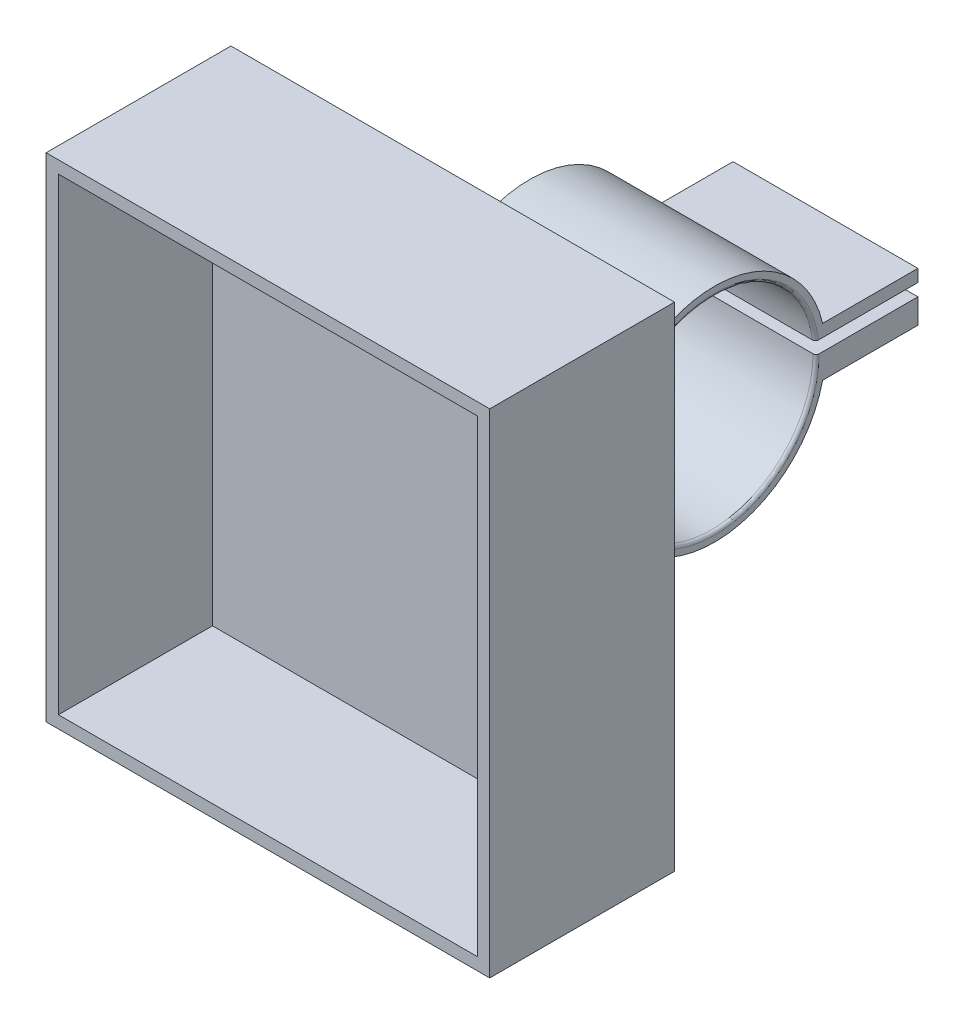
ISO-10303-21;
HEADER;
FILE_DESCRIPTION(('STEP AP214'),'2;1');
FILE_NAME('part.step','',(''),(''),'','','');
FILE_SCHEMA(('AUTOMOTIVE_DESIGN { 1 0 10303 214 1 1 1 1 }'));
ENDSEC;
DATA;
#1=APPLICATION_CONTEXT('core data for automotive mechanical design processes');
#2=APPLICATION_PROTOCOL_DEFINITION('international standard','automotive_design',2000,#1);
#3=PRODUCT_CONTEXT('',#1,'mechanical');
#4=PRODUCT('Part','Part','',(#3));
#5=PRODUCT_RELATED_PRODUCT_CATEGORY('part','',(#4));
#6=PRODUCT_DEFINITION_FORMATION('','',#4);
#7=PRODUCT_DEFINITION_CONTEXT('part definition',#1,'design');
#8=PRODUCT_DEFINITION('design','',#6,#7);
#9=PRODUCT_DEFINITION_SHAPE('','',#8);
#10=(LENGTH_UNIT() NAMED_UNIT(*) SI_UNIT(.MILLI.,.METRE.));
#11=(NAMED_UNIT(*) PLANE_ANGLE_UNIT() SI_UNIT($,.RADIAN.));
#12=(NAMED_UNIT(*) SI_UNIT($,.STERADIAN.) SOLID_ANGLE_UNIT());
#13=UNCERTAINTY_MEASURE_WITH_UNIT(LENGTH_MEASURE(1.E-05),#10,'distance_accuracy_value','');
#14=(GEOMETRIC_REPRESENTATION_CONTEXT(3) GLOBAL_UNCERTAINTY_ASSIGNED_CONTEXT((#13)) GLOBAL_UNIT_ASSIGNED_CONTEXT((#10,
#11,#12)) REPRESENTATION_CONTEXT('',''));
#15=CARTESIAN_POINT('',(0.,0.,0.));
#16=DIRECTION('',(0.,0.,1.));
#17=DIRECTION('',(1.,0.,0.));
#18=AXIS2_PLACEMENT_3D('',#15,#16,#17);
#19=CARTESIAN_POINT('',(-15.,0.,-60.4925687367722));
#20=DIRECTION('',(0.,0.,-1.));
#21=DIRECTION('',(-1.,0.,0.));
#22=AXIS2_PLACEMENT_3D('',#19,#20,#21);
#23=PLANE('',#22);
#24=DIRECTION('',(0.,1.,0.));
#25=VECTOR('',#24,1.);
#26=CARTESIAN_POINT('',(-15.,0.,-60.4925687367722));
#27=LINE('',#26,#25);
#28=CARTESIAN_POINT('',(-15.,-4.,-60.4925687367722));
#29=VERTEX_POINT('',#28);
#30=CARTESIAN_POINT('',(-15.,0.,-60.4925687367722));
#31=VERTEX_POINT('',#30);
#32=EDGE_CURVE('E191',#29,#31,#27,.T.);
#33=ORIENTED_EDGE('',*,*,#32,.T.);
#34=DIRECTION('',(1.,0.,0.));
#35=VECTOR('',#34,1.);
#36=CARTESIAN_POINT('',(-25.,0.,-60.4925687367722));
#37=LINE('',#36,#35);
#38=CARTESIAN_POINT('',(15.,0.,-60.4925687367722));
#39=VERTEX_POINT('',#38);
#40=EDGE_CURVE('E179',#31,#39,#37,.T.);
#41=ORIENTED_EDGE('',*,*,#40,.T.);
#42=DIRECTION('',(0.,1.,0.));
#43=VECTOR('',#42,1.);
#44=CARTESIAN_POINT('',(15.,0.,-60.4925687367722));
#45=LINE('',#44,#43);
#46=CARTESIAN_POINT('',(15.,-4.,-60.4925687367722));
#47=VERTEX_POINT('',#46);
#48=EDGE_CURVE('E193',#47,#39,#45,.T.);
#49=ORIENTED_EDGE('',*,*,#48,.F.);
#50=DIRECTION('',(1.,0.,0.));
#51=VECTOR('',#50,1.);
#52=CARTESIAN_POINT('',(-15.,-4.,-60.4925687367722));
#53=LINE('',#52,#51);
#54=EDGE_CURVE('E226',#29,#47,#53,.T.);
#55=ORIENTED_EDGE('',*,*,#54,.F.);
#56=EDGE_LOOP('',(#33,#41,#49,#55));
#57=FACE_BOUND('',#56,.T.);
#58=ADVANCED_FACE('F50',(#57),#23,.T.);
#59=CARTESIAN_POINT('',(-36.,-40.,30.));
#60=DIRECTION('',(1.,0.,0.));
#61=DIRECTION('',(0.,0.,-1.));
#62=AXIS2_PLACEMENT_3D('',#59,#60,#61);
#63=PLANE('',#62);
#64=DIRECTION('',(0.,-1.,0.));
#65=VECTOR('',#64,1.);
#66=CARTESIAN_POINT('',(-36.,-40.,0.));
#67=LINE('',#66,#65);
#68=CARTESIAN_POINT('',(-36.,40.,0.));
#69=VERTEX_POINT('',#68);
#70=CARTESIAN_POINT('',(-36.,-40.,0.));
#71=VERTEX_POINT('',#70);
#72=EDGE_CURVE('E284',#69,#71,#67,.T.);
#73=ORIENTED_EDGE('',*,*,#72,.T.);
#74=DIRECTION('',(0.,0.,-1.));
#75=VECTOR('',#74,1.);
#76=CARTESIAN_POINT('',(-36.,-40.,30.));
#77=LINE('',#76,#75);
#78=CARTESIAN_POINT('',(-36.,-40.,30.));
#79=VERTEX_POINT('',#78);
#80=EDGE_CURVE('E328',#79,#71,#77,.T.);
#81=ORIENTED_EDGE('',*,*,#80,.F.);
#82=DIRECTION('',(0.,-1.,0.));
#83=VECTOR('',#82,1.);
#84=CARTESIAN_POINT('',(-36.,-40.,30.));
#85=LINE('',#84,#83);
#86=CARTESIAN_POINT('',(-36.,40.,30.));
#87=VERTEX_POINT('',#86);
#88=EDGE_CURVE('E291',#87,#79,#85,.T.);
#89=ORIENTED_EDGE('',*,*,#88,.F.);
#90=DIRECTION('',(0.,0.,-1.));
#91=VECTOR('',#90,1.);
#92=CARTESIAN_POINT('',(-36.,40.,30.));
#93=LINE('',#92,#91);
#94=EDGE_CURVE('E310',#87,#69,#93,.T.);
#95=ORIENTED_EDGE('',*,*,#94,.T.);
#96=EDGE_LOOP('',(#73,#81,#89,#95));
#97=FACE_BOUND('',#96,.T.);
#98=ADVANCED_FACE('F407',(#97),#63,.F.);
#99=CARTESIAN_POINT('',(36.,-40.,30.));
#100=DIRECTION('',(0.,1.,0.));
#101=DIRECTION('',(-1.,0.,0.));
#102=AXIS2_PLACEMENT_3D('',#99,#100,#101);
#103=PLANE('',#102);
#104=DIRECTION('',(1.,0.,0.));
#105=VECTOR('',#104,1.);
#106=CARTESIAN_POINT('',(36.,-40.,0.));
#107=LINE('',#106,#105);
#108=CARTESIAN_POINT('',(36.,-40.,0.));
#109=VERTEX_POINT('',#108);
#110=EDGE_CURVE('E311',#71,#109,#107,.T.);
#111=ORIENTED_EDGE('',*,*,#110,.T.);
#112=DIRECTION('',(0.,0.,-1.));
#113=VECTOR('',#112,1.);
#114=CARTESIAN_POINT('',(36.,-40.,30.));
#115=LINE('',#114,#113);
#116=CARTESIAN_POINT('',(36.,-40.,30.));
#117=VERTEX_POINT('',#116);
#118=EDGE_CURVE('E327',#117,#109,#115,.T.);
#119=ORIENTED_EDGE('',*,*,#118,.F.);
#120=DIRECTION('',(1.,0.,0.));
#121=VECTOR('',#120,1.);
#122=CARTESIAN_POINT('',(36.,-40.,30.));
#123=LINE('',#122,#121);
#124=EDGE_CURVE('E300',#79,#117,#123,.T.);
#125=ORIENTED_EDGE('',*,*,#124,.F.);
#126=ORIENTED_EDGE('',*,*,#80,.T.);
#127=EDGE_LOOP('',(#111,#119,#125,#126));
#128=FACE_BOUND('',#127,.T.);
#129=ADVANCED_FACE('F414',(#128),#103,.F.);
#130=CARTESIAN_POINT('',(36.,-40.,30.));
#131=DIRECTION('',(-1.,0.,0.));
#132=DIRECTION('',(0.,0.,1.));
#133=AXIS2_PLACEMENT_3D('',#130,#131,#132);
#134=PLANE('',#133);
#135=DIRECTION('',(0.,1.,0.));
#136=VECTOR('',#135,1.);
#137=CARTESIAN_POINT('',(36.,-40.,0.));
#138=LINE('',#137,#136);
#139=CARTESIAN_POINT('',(36.,40.,0.));
#140=VERTEX_POINT('',#139);
#141=EDGE_CURVE('E313',#109,#140,#138,.T.);
#142=ORIENTED_EDGE('',*,*,#141,.T.);
#143=DIRECTION('',(0.,0.,-1.));
#144=VECTOR('',#143,1.);
#145=CARTESIAN_POINT('',(36.,40.,30.));
#146=LINE('',#145,#144);
#147=CARTESIAN_POINT('',(36.,40.,30.));
#148=VERTEX_POINT('',#147);
#149=EDGE_CURVE('E325',#148,#140,#146,.T.);
#150=ORIENTED_EDGE('',*,*,#149,.F.);
#151=DIRECTION('',(0.,1.,0.));
#152=VECTOR('',#151,1.);
#153=CARTESIAN_POINT('',(36.,-40.,30.));
#154=LINE('',#153,#152);
#155=EDGE_CURVE('E301',#117,#148,#154,.T.);
#156=ORIENTED_EDGE('',*,*,#155,.F.);
#157=ORIENTED_EDGE('',*,*,#118,.T.);
#158=EDGE_LOOP('',(#142,#150,#156,#157));
#159=FACE_BOUND('',#158,.T.);
#160=ADVANCED_FACE('F420',(#159),#134,.F.);
#161=CARTESIAN_POINT('',(36.,40.,30.));
#162=DIRECTION('',(0.,-1.,0.));
#163=DIRECTION('',(1.,0.,0.));
#164=AXIS2_PLACEMENT_3D('',#161,#162,#163);
#165=PLANE('',#164);
#166=DIRECTION('',(-1.,0.,0.));
#167=VECTOR('',#166,1.);
#168=CARTESIAN_POINT('',(36.,40.,0.));
#169=LINE('',#168,#167);
#170=EDGE_CURVE('E296',#140,#69,#169,.T.);
#171=ORIENTED_EDGE('',*,*,#170,.T.);
#172=ORIENTED_EDGE('',*,*,#94,.F.);
#173=DIRECTION('',(-1.,0.,0.));
#174=VECTOR('',#173,1.);
#175=CARTESIAN_POINT('',(36.,40.,30.));
#176=LINE('',#175,#174);
#177=EDGE_CURVE('E302',#148,#87,#176,.T.);
#178=ORIENTED_EDGE('',*,*,#177,.F.);
#179=ORIENTED_EDGE('',*,*,#149,.T.);
#180=EDGE_LOOP('',(#171,#172,#178,#179));
#181=FACE_BOUND('',#180,.T.);
#182=ADVANCED_FACE('F423',(#181),#165,.F.);
#183=CARTESIAN_POINT('',(0.,0.,30.));
#184=DIRECTION('',(0.,0.,1.));
#185=DIRECTION('',(1.,0.,0.));
#186=AXIS2_PLACEMENT_3D('',#183,#184,#185);
#187=PLANE('',#186);
#188=DIRECTION('',(0.,-1.,0.));
#189=VECTOR('',#188,1.);
#190=CARTESIAN_POINT('',(-34.,-38.,30.));
#191=LINE('',#190,#189);
#192=CARTESIAN_POINT('',(-34.,38.,30.));
#193=VERTEX_POINT('',#192);
#194=CARTESIAN_POINT('',(-34.,-38.,30.));
#195=VERTEX_POINT('',#194);
#196=EDGE_CURVE('E268',#193,#195,#191,.T.);
#197=ORIENTED_EDGE('',*,*,#196,.F.);
#198=DIRECTION('',(-1.,0.,0.));
#199=VECTOR('',#198,1.);
#200=CARTESIAN_POINT('',(34.,38.,30.));
#201=LINE('',#200,#199);
#202=CARTESIAN_POINT('',(34.,38.,30.));
#203=VERTEX_POINT('',#202);
#204=EDGE_CURVE('E254',#203,#193,#201,.T.);
#205=ORIENTED_EDGE('',*,*,#204,.F.);
#206=DIRECTION('',(0.,1.,0.));
#207=VECTOR('',#206,1.);
#208=CARTESIAN_POINT('',(34.,-38.,30.));
#209=LINE('',#208,#207);
#210=CARTESIAN_POINT('',(34.,-38.,30.));
#211=VERTEX_POINT('',#210);
#212=EDGE_CURVE('E271',#211,#203,#209,.T.);
#213=ORIENTED_EDGE('',*,*,#212,.F.);
#214=DIRECTION('',(1.,0.,0.));
#215=VECTOR('',#214,1.);
#216=CARTESIAN_POINT('',(34.,-38.,30.));
#217=LINE('',#216,#215);
#218=EDGE_CURVE('E267',#195,#211,#217,.T.);
#219=ORIENTED_EDGE('',*,*,#218,.F.);
#220=EDGE_LOOP('',(#197,#205,#213,#219));
#221=FACE_BOUND('',#220,.T.);
#222=ORIENTED_EDGE('',*,*,#88,.T.);
#223=ORIENTED_EDGE('',*,*,#124,.T.);
#224=ORIENTED_EDGE('',*,*,#155,.T.);
#225=ORIENTED_EDGE('',*,*,#177,.T.);
#226=EDGE_LOOP('',(#222,#223,#224,#225));
#227=FACE_BOUND('',#226,.T.);
#228=ADVANCED_FACE('F424',(#221,#227),#187,.T.);
#229=CARTESIAN_POINT('',(0.,0.,0.));
#230=DIRECTION('',(0.,0.,1.));
#231=DIRECTION('',(1.,0.,0.));
#232=AXIS2_PLACEMENT_3D('',#229,#230,#231);
#233=PLANE('',#232);
#234=CARTESIAN_POINT('',(0.,0.,0.));
#235=DIRECTION('',(0.,0.,1.));
#236=DIRECTION('',(1.,0.,0.));
#237=AXIS2_PLACEMENT_3D('',#234,#235,#236);
#238=CIRCLE('',#237,14.25);
#239=CARTESIAN_POINT('',(14.25,0.,0.));
#240=VERTEX_POINT('',#239);
#241=EDGE_CURVE('E336',#240,#240,#238,.T.);
#242=ORIENTED_EDGE('',*,*,#241,.T.);
#243=EDGE_LOOP('',(#242));
#244=FACE_BOUND('',#243,.T.);
#245=ORIENTED_EDGE('',*,*,#72,.F.);
#246=ORIENTED_EDGE('',*,*,#170,.F.);
#247=ORIENTED_EDGE('',*,*,#141,.F.);
#248=ORIENTED_EDGE('',*,*,#110,.F.);
#249=EDGE_LOOP('',(#245,#246,#247,#248));
#250=FACE_BOUND('',#249,.T.);
#251=ADVANCED_FACE('F430',(#244,#250),#233,.F.);
#252=CARTESIAN_POINT('',(-34.,-38.,5.));
#253=DIRECTION('',(-1.,0.,0.));
#254=DIRECTION('',(0.,0.,1.));
#255=AXIS2_PLACEMENT_3D('',#252,#253,#254);
#256=PLANE('',#255);
#257=ORIENTED_EDGE('',*,*,#196,.T.);
#258=DIRECTION('',(0.,0.,1.));
#259=VECTOR('',#258,1.);
#260=CARTESIAN_POINT('',(-34.,-38.,5.));
#261=LINE('',#260,#259);
#262=CARTESIAN_POINT('',(-34.,-38.,5.));
#263=VERTEX_POINT('',#262);
#264=EDGE_CURVE('E263',#263,#195,#261,.T.);
#265=ORIENTED_EDGE('',*,*,#264,.F.);
#266=DIRECTION('',(0.,-1.,0.));
#267=VECTOR('',#266,1.);
#268=CARTESIAN_POINT('',(-34.,-38.,5.));
#269=LINE('',#268,#267);
#270=CARTESIAN_POINT('',(-34.,38.,5.));
#271=VERTEX_POINT('',#270);
#272=EDGE_CURVE('E247',#271,#263,#269,.T.);
#273=ORIENTED_EDGE('',*,*,#272,.F.);
#274=DIRECTION('',(0.,0.,1.));
#275=VECTOR('',#274,1.);
#276=CARTESIAN_POINT('',(-34.,38.,5.));
#277=LINE('',#276,#275);
#278=EDGE_CURVE('E277',#271,#193,#277,.T.);
#279=ORIENTED_EDGE('',*,*,#278,.T.);
#280=EDGE_LOOP('',(#257,#265,#273,#279));
#281=FACE_BOUND('',#280,.T.);
#282=ADVANCED_FACE('F427',(#281),#256,.F.);
#283=CARTESIAN_POINT('',(34.,38.,5.));
#284=DIRECTION('',(0.,1.,0.));
#285=DIRECTION('',(-1.,0.,0.));
#286=AXIS2_PLACEMENT_3D('',#283,#284,#285);
#287=PLANE('',#286);
#288=ORIENTED_EDGE('',*,*,#204,.T.);
#289=ORIENTED_EDGE('',*,*,#278,.F.);
#290=DIRECTION('',(-1.,0.,0.));
#291=VECTOR('',#290,1.);
#292=CARTESIAN_POINT('',(34.,38.,5.));
#293=LINE('',#292,#291);
#294=CARTESIAN_POINT('',(34.,38.,5.));
#295=VERTEX_POINT('',#294);
#296=EDGE_CURVE('E262',#295,#271,#293,.T.);
#297=ORIENTED_EDGE('',*,*,#296,.F.);
#298=DIRECTION('',(0.,0.,1.));
#299=VECTOR('',#298,1.);
#300=CARTESIAN_POINT('',(34.,38.,5.));
#301=LINE('',#300,#299);
#302=EDGE_CURVE('E281',#295,#203,#301,.T.);
#303=ORIENTED_EDGE('',*,*,#302,.T.);
#304=EDGE_LOOP('',(#288,#289,#297,#303));
#305=FACE_BOUND('',#304,.T.);
#306=ADVANCED_FACE('F440',(#305),#287,.F.);
#307=CARTESIAN_POINT('',(34.,-38.,5.));
#308=DIRECTION('',(1.,0.,0.));
#309=DIRECTION('',(0.,0.,-1.));
#310=AXIS2_PLACEMENT_3D('',#307,#308,#309);
#311=PLANE('',#310);
#312=ORIENTED_EDGE('',*,*,#212,.T.);
#313=ORIENTED_EDGE('',*,*,#302,.F.);
#314=DIRECTION('',(0.,1.,0.));
#315=VECTOR('',#314,1.);
#316=CARTESIAN_POINT('',(34.,-38.,5.));
#317=LINE('',#316,#315);
#318=CARTESIAN_POINT('',(34.,-38.,5.));
#319=VERTEX_POINT('',#318);
#320=EDGE_CURVE('E260',#319,#295,#317,.T.);
#321=ORIENTED_EDGE('',*,*,#320,.F.);
#322=DIRECTION('',(0.,0.,1.));
#323=VECTOR('',#322,1.);
#324=CARTESIAN_POINT('',(34.,-38.,5.));
#325=LINE('',#324,#323);
#326=EDGE_CURVE('E290',#319,#211,#325,.T.);
#327=ORIENTED_EDGE('',*,*,#326,.T.);
#328=EDGE_LOOP('',(#312,#313,#321,#327));
#329=FACE_BOUND('',#328,.T.);
#330=ADVANCED_FACE('F442',(#329),#311,.F.);
#331=CARTESIAN_POINT('',(34.,-38.,5.));
#332=DIRECTION('',(0.,-1.,0.));
#333=DIRECTION('',(1.,0.,0.));
#334=AXIS2_PLACEMENT_3D('',#331,#332,#333);
#335=PLANE('',#334);
#336=ORIENTED_EDGE('',*,*,#218,.T.);
#337=ORIENTED_EDGE('',*,*,#326,.F.);
#338=DIRECTION('',(1.,0.,0.));
#339=VECTOR('',#338,1.);
#340=CARTESIAN_POINT('',(34.,-38.,5.));
#341=LINE('',#340,#339);
#342=EDGE_CURVE('E255',#263,#319,#341,.T.);
#343=ORIENTED_EDGE('',*,*,#342,.F.);
#344=ORIENTED_EDGE('',*,*,#264,.T.);
#345=EDGE_LOOP('',(#336,#337,#343,#344));
#346=FACE_BOUND('',#345,.T.);
#347=ADVANCED_FACE('F437',(#346),#335,.F.);
#348=CARTESIAN_POINT('',(0.,0.,5.));
#349=DIRECTION('',(0.,0.,1.));
#350=DIRECTION('',(1.,0.,0.));
#351=AXIS2_PLACEMENT_3D('',#348,#349,#350);
#352=PLANE('',#351);
#353=ORIENTED_EDGE('',*,*,#272,.T.);
#354=ORIENTED_EDGE('',*,*,#342,.T.);
#355=ORIENTED_EDGE('',*,*,#320,.T.);
#356=ORIENTED_EDGE('',*,*,#296,.T.);
#357=EDGE_LOOP('',(#353,#354,#355,#356));
#358=FACE_BOUND('',#357,.T.);
#359=ADVANCED_FACE('F445',(#358),#352,.T.);
#360=CARTESIAN_POINT('',(0.,0.,-15.));
#361=DIRECTION('',(0.,0.,1.));
#362=DIRECTION('',(1.,0.,0.));
#363=AXIS2_PLACEMENT_3D('',#360,#361,#362);
#364=CYLINDRICAL_SURFACE('',#363,10.25);
#365=CARTESIAN_POINT('',(10.25,0.,-9.47936499938877));
#366=CARTESIAN_POINT('',(10.249997772282,0.264519076584649,-9.47936701620797));
#367=CARTESIAN_POINT('',(10.2397441218711,0.529124496482216,-9.4852112686551));
#368=CARTESIAN_POINT('',(10.1988524814933,1.0563624821298,-9.5084491330026));
#369=CARTESIAN_POINT('',(10.1682014925191,1.31899368172281,-9.52585010986655));
#370=CARTESIAN_POINT('',(10.0868204809152,1.84076662311007,-9.5718158341821));
#371=CARTESIAN_POINT('',(10.0360439953682,2.09989884525778,-9.60040641267984));
#372=CARTESIAN_POINT('',(9.91506466552643,2.61213502550928,-9.66803447550246));
#373=CARTESIAN_POINT('',(9.84486475035596,2.86523988631563,-9.70707038460409));
#374=CARTESIAN_POINT('',(9.68622852714192,3.36263269484833,-9.79445153895515));
#375=CARTESIAN_POINT('',(9.59788073180206,3.60695691594657,-9.84275152743456));
#376=CARTESIAN_POINT('',(9.40364867835215,4.08666902217371,-9.94769560275203));
#377=CARTESIAN_POINT('',(9.29776382352484,4.32205660288872,-10.0043399735094));
#378=CARTESIAN_POINT('',(9.06947415220393,4.78258886852613,-10.1247269366167));
#379=CARTESIAN_POINT('',(8.94707913500893,5.00773952419547,-10.1884653145558));
#380=CARTESIAN_POINT('',(8.68661251819837,5.44706409397579,-10.321794742583));
#381=CARTESIAN_POINT('',(8.54853514595756,5.66123392370104,-10.3913879453537));
#382=CARTESIAN_POINT('',(8.24718552075165,6.09266328197374,-10.5402036239691));
#383=CARTESIAN_POINT('',(8.08281638148095,6.30904201607955,-10.6197587310245));
#384=CARTESIAN_POINT('',(7.73814156015187,6.72734129410007,-10.7822623976682));
#385=CARTESIAN_POINT('',(7.55783525242426,6.9292612698219,-10.8652110904149));
#386=CARTESIAN_POINT('',(7.18198830136747,7.31811047700305,-11.0327808893572));
#387=CARTESIAN_POINT('',(6.98643093216818,7.50502278048896,-11.1174037535339));
#388=CARTESIAN_POINT('',(6.58108602120329,7.86288155681463,-11.2863340584831));
#389=CARTESIAN_POINT('',(6.37129804311026,8.03382753972565,-11.3706414895003));
#390=CARTESIAN_POINT('',(5.91488391073257,8.37655288293503,-11.5459318841658));
#391=CARTESIAN_POINT('',(5.66672531682515,8.54643210418336,-11.6366536480956));
#392=CARTESIAN_POINT('',(5.1549230262351,8.86453935462094,-11.8124258786654));
#393=CARTESIAN_POINT('',(4.89127716045122,9.01276434079662,-11.8974755473097));
#394=CARTESIAN_POINT('',(4.35008434235251,9.28606725394415,-12.0587906410431));
#395=CARTESIAN_POINT('',(4.07255489521586,9.4111734400318,-12.1350667467784));
#396=CARTESIAN_POINT('',(3.50489612393043,9.63698227375308,-12.2758685051866));
#397=CARTESIAN_POINT('',(3.21477093133944,9.73769285318384,-12.3403979753684));
#398=CARTESIAN_POINT('',(2.68898225772109,9.89392133115211,-12.4421781801048));
#399=CARTESIAN_POINT('',(2.45537095316852,9.95450712622937,-12.4823071358135));
#400=CARTESIAN_POINT('',(1.98300837340899,10.0592578610227,-12.5523654666443));
#401=CARTESIAN_POINT('',(1.74425812652716,10.1034260542443,-12.5822968625368));
#402=CARTESIAN_POINT('',(1.26330476014067,10.1747534875964,-12.6309219714102));
#403=CARTESIAN_POINT('',(1.02110486383679,10.2019276604604,-12.6496255497513));
#404=CARTESIAN_POINT('',(0.534747386523672,10.2389461901088,-12.6751597867866));
#405=CARTESIAN_POINT('',(0.290589766279507,10.2487901987012,-12.6819902069293));
#406=CARTESIAN_POINT('',(-0.198166247123225,10.2510014587125,-12.6835219539042));
#407=CARTESIAN_POINT('',(-0.442764796176201,10.2433455803668,-12.678207228386));
#408=CARTESIAN_POINT('',(-0.93023119910778,10.2106242542887,-12.6556157153616));
#409=CARTESIAN_POINT('',(-1.17309904626852,10.1855587390165,-12.6383388814488));
#410=CARTESIAN_POINT('',(-1.65550574864583,10.1183570148594,-12.5924412208023));
#411=CARTESIAN_POINT('',(-1.89504259388151,10.0762109253703,-12.5638138283159));
#412=CARTESIAN_POINT('',(-2.36910921634494,9.97539772181839,-12.4962039797184));
#413=CARTESIAN_POINT('',(-2.60363887304666,9.91673021055638,-12.4572212746515));
#414=CARTESIAN_POINT('',(-3.06556307278674,9.78378120583667,-12.3702981595879));
#415=CARTESIAN_POINT('',(-3.29298045201288,9.70955724126812,-12.3223908241364));
#416=CARTESIAN_POINT('',(-3.74058008280692,9.54606599529802,-12.2188939536657));
#417=CARTESIAN_POINT('',(-3.96075981439855,9.45679353929937,-12.1633017773125));
#418=CARTESIAN_POINT('',(-4.60906270031334,9.16749207849313,-11.9871703826154));
#419=CARTESIAN_POINT('',(-5.02518101941444,8.94591149227808,-11.8572302605224));
#420=CARTESIAN_POINT('',(-5.88338568601482,8.41089592254884,-11.5619505635708));
#421=CARTESIAN_POINT('',(-6.31905767401842,8.08845317920035,-11.3942687992847));
#422=CARTESIAN_POINT('',(-6.93007100212049,7.55709231450766,-11.1414003860152));
#423=CARTESIAN_POINT('',(-7.12678974729825,7.37186747208288,-11.0568233998803));
#424=CARTESIAN_POINT('',(-7.50535496227567,6.98606905056694,-10.8890354908677));
#425=CARTESIAN_POINT('',(-7.68719903401225,6.78549300663765,-10.8058247899811));
#426=CARTESIAN_POINT('',(-8.05463493304055,6.34636130367998,-10.6334327144376));
#427=CARTESIAN_POINT('',(-8.23834028133085,6.10607276065714,-10.5446350523361));
#428=CARTESIAN_POINT('',(-8.58466358117383,5.6087273259798,-10.3734801024955));
#429=CARTESIAN_POINT('',(-8.74729007019546,5.3516772869605,-10.2911202126955));
#430=CARTESIAN_POINT('',(-9.04998636157031,4.82215933647048,-10.1351171397251));
#431=CARTESIAN_POINT('',(-9.19006110526259,4.54969482021346,-10.0614720479849));
#432=CARTESIAN_POINT('',(-9.44607930661591,3.99104698345921,-9.92504427403318));
#433=CARTESIAN_POINT('',(-9.56202575158638,3.70486536667185,-9.86226024728267));
#434=CARTESIAN_POINT('',(-9.76106877683551,3.14119028883933,-9.75340896982437));
#435=CARTESIAN_POINT('',(-9.84588553448825,2.86447007118699,-9.70648452097918));
#436=CARTESIAN_POINT('',(-9.99211181758109,2.30310780059989,-9.62506289284931));
#437=CARTESIAN_POINT('',(-10.0535222041813,2.01846603952568,-9.59056525636369));
#438=CARTESIAN_POINT('',(-10.1519671963241,1.4439317050169,-9.53505432878852));
#439=CARTESIAN_POINT('',(-10.189021547722,1.15404358132125,-9.51403011491134));
#440=CARTESIAN_POINT('',(-10.2382276924758,0.571496474633397,-9.48607766995324));
#441=CARTESIAN_POINT('',(-10.2503822289675,0.278837800433299,-9.47914788613314));
#442=CARTESIAN_POINT('',(-10.2496464040508,-0.271149396969233,-9.47956587334594));
#443=CARTESIAN_POINT('',(-10.2395957018111,-0.528488532145676,-9.48529482688484));
#444=CARTESIAN_POINT('',(-10.2002210891216,-1.04118963735186,-9.50767214025927));
#445=CARTESIAN_POINT('',(-10.1708990484919,-1.29655179676776,-9.52431944073138));
#446=CARTESIAN_POINT('',(-10.0933531995476,-1.80346124099976,-9.56813225679973));
#447=CARTESIAN_POINT('',(-10.0451294749466,-2.05500854270637,-9.59529772581208));
#448=CARTESIAN_POINT('',(-9.93035506290933,-2.55259576736652,-9.65951116446066));
#449=CARTESIAN_POINT('',(-9.86380381575373,-2.79863552187238,-9.69655943591484));
#450=CARTESIAN_POINT('',(-9.71383669852147,-3.28133140146672,-9.77930134854855));
#451=CARTESIAN_POINT('',(-9.63059028276788,-3.51805529762093,-9.8249078471487));
#452=CARTESIAN_POINT('',(-9.44761573217907,-3.98341490915179,-9.92405156519192));
#453=CARTESIAN_POINT('',(-9.34788176618569,-4.21204772809716,-9.97759158979122));
#454=CARTESIAN_POINT('',(-9.13282406546957,-4.66001584079167,-10.0915054494092));
#455=CARTESIAN_POINT('',(-9.01750350200322,-4.87935301394384,-10.1518778938952));
#456=CARTESIAN_POINT('',(-8.77206454775717,-5.30795618018436,-10.2783315545162));
#457=CARTESIAN_POINT('',(-8.64194082516845,-5.51721850564016,-10.3444148255065));
#458=CARTESIAN_POINT('',(-8.35352278121774,-5.94597758022981,-10.4881429554006));
#459=CARTESIAN_POINT('',(-8.19370656639242,-6.16428772819165,-10.5662762688494));
#460=CARTESIAN_POINT('',(-7.85802313299172,-6.58686805012573,-10.7263279305793));
#461=CARTESIAN_POINT('',(-7.68214863933788,-6.79113178627599,-10.8082479860333));
#462=CARTESIAN_POINT('',(-7.31516505188381,-7.18493998299601,-10.9741437890637));
#463=CARTESIAN_POINT('',(-7.12404291319149,-7.37447156001425,-11.058121253334));
#464=CARTESIAN_POINT('',(-6.72752867936334,-7.73790629448114,-11.2262145569714));
#465=CARTESIAN_POINT('',(-6.52213603190281,-7.91180884642705,-11.3103304015711));
#466=CARTESIAN_POINT('',(-6.07442669975909,-8.2615485261043,-11.485953666827));
#467=CARTESIAN_POINT('',(-5.83053633706579,-8.43548237750633,-11.5772527274582));
#468=CARTESIAN_POINT('',(-5.32712404825027,-8.76209346115811,-11.75485264458));
#469=CARTESIAN_POINT('',(-5.06759991232121,-8.91476767824772,-11.841152791085));
#470=CARTESIAN_POINT('',(-4.53440208671995,-9.19742594230974,-12.0057074086744));
#471=CARTESIAN_POINT('',(-4.26074412936347,-9.32743454163621,-12.0839705475252));
#472=CARTESIAN_POINT('',(-3.7005113451067,-9.56352655906522,-12.2295055172165));
#473=CARTESIAN_POINT('',(-3.41394051216499,-9.66961731484302,-12.2967807172601));
#474=CARTESIAN_POINT('',(-2.89199587721539,-9.83652052783761,-12.4045344971486));
#475=CARTESIAN_POINT('',(-2.65870573257551,-9.90216401255776,-12.4476688831337));
#476=CARTESIAN_POINT('',(-2.18652964603533,-10.017015040232,-12.5239587900922));
#477=CARTESIAN_POINT('',(-1.94764482682675,-10.0662258510203,-12.5571162949581));
#478=CARTESIAN_POINT('',(-1.46593476099523,-10.1475683117232,-12.6123115043365));
#479=CARTESIAN_POINT('',(-1.22311337196106,-10.1797157499175,-12.6343594872297));
#480=CARTESIAN_POINT('',(-0.734995046002121,-10.2265531746891,-12.6665858910638));
#481=CARTESIAN_POINT('',(-0.48969806941139,-10.2412428810945,-12.6767641215118));
#482=CARTESIAN_POINT('',(0.00199391500462832,-10.2529549532952,-12.6848738725892));
#483=CARTESIAN_POINT('',(0.248390126661427,-10.2499433578976,-12.6827818518948));
#484=CARTESIAN_POINT('',(0.739914698825937,-10.2262196999597,-12.6663762748288));
#485=CARTESIAN_POINT('',(0.985043054643484,-10.2055075719872,-12.6520626732785));
#486=CARTESIAN_POINT('',(1.47235022120758,-10.1466721223633,-12.6117387739645));
#487=CARTESIAN_POINT('',(1.71452736389064,-10.1085393839905,-12.585722150242));
#488=CARTESIAN_POINT('',(2.19417218406893,-10.0153784215539,-12.5229168576762));
#489=CARTESIAN_POINT('',(2.43163977569422,-9.96034988972743,-12.4861279926134));
#490=CARTESIAN_POINT('',(2.89679952074493,-9.83504728342829,-12.4036437187107));
#491=CARTESIAN_POINT('',(3.12458668778807,-9.76502666129928,-12.35809752686));
#492=CARTESIAN_POINT('',(3.57324020221696,-9.60993437035669,-12.2590622254572));
#493=CARTESIAN_POINT('',(3.79410414785559,-9.5248575449251,-12.2055703956052));
#494=CARTESIAN_POINT('',(4.44487193832846,-9.24812016742324,-12.0352971408735));
#495=CARTESIAN_POINT('',(4.8631923493345,-9.03488700573248,-11.9086727815464));
#496=CARTESIAN_POINT('',(5.72496924385396,-8.51920105558191,-11.6198858699287));
#497=CARTESIAN_POINT('',(6.16240681968389,-8.20807255308407,-11.4552524336377));
#498=CARTESIAN_POINT('',(6.77750771694413,-7.69411782238787,-11.2055496630691));
#499=CARTESIAN_POINT('',(6.97583019979468,-7.51477243657646,-11.1217936813681));
#500=CARTESIAN_POINT('',(7.35812399046556,-7.14086665772668,-10.9551443540285));
#501=CARTESIAN_POINT('',(7.54209303888388,-6.94630387890247,-10.8722511459733));
#502=CARTESIAN_POINT('',(7.91631229049929,-6.51804831284799,-10.6991769434172));
#503=CARTESIAN_POINT('',(8.10458116566939,-6.28247958487988,-10.6093437841493));
#504=CARTESIAN_POINT('',(8.46046511910795,-5.79432635076227,-10.435513560322));
#505=CARTESIAN_POINT('',(8.62808771969152,-5.54174809409541,-10.351514375092));
#506=CARTESIAN_POINT('',(8.94125851803259,-5.02083079577813,-10.1916388130479));
#507=CARTESIAN_POINT('',(9.08680877109352,-4.75249322481455,-10.1157616801292));
#508=CARTESIAN_POINT('',(9.35423941528465,-4.20170924201309,-9.97432541105525));
#509=CARTESIAN_POINT('',(9.47612633535899,-3.91926674897732,-9.90876342979832));
#510=CARTESIAN_POINT('',(9.67526367811933,-3.39354727480499,-9.80049186361761));
#511=CARTESIAN_POINT('',(9.75659691704004,-3.15221881009947,-9.75579160224726));
#512=CARTESIAN_POINT('',(9.90137740723689,-2.6627657536646,-9.67568189483599));
#513=CARTESIAN_POINT('',(9.9648278159665,-2.41464237016818,-9.64027080874316));
#514=CARTESIAN_POINT('',(10.0730047348587,-1.91378309502982,-9.57961850769514));
#515=CARTESIAN_POINT('',(10.1177773897455,-1.66106020011982,-9.55435223512476));
#516=CARTESIAN_POINT('',(10.1882648113444,-1.15223860920685,-9.51447180275596));
#517=CARTESIAN_POINT('',(10.2139906354492,-0.896141959829225,-9.49985146267976));
#518=CARTESIAN_POINT('',(10.236691016893,-0.532947417528673,-9.48694096180553));
#519=CARTESIAN_POINT('',(10.241679945674,-0.42644910368736,-9.48410172453271));
#520=CARTESIAN_POINT('',(10.2483350472964,-0.213305214843409,-9.48031324517058));
#521=CARTESIAN_POINT('',(10.2500008982625,-0.106659626576729,-9.47936418616506));
#522=CARTESIAN_POINT('',(10.25,0.,-9.47936499938877));
#523=B_SPLINE_CURVE_WITH_KNOTS('',3,(#365,#366,#367,#368,#369,#370,#371,#372,#373,#374,#375,
#376,#377,#378,#379,#380,#381,#382,#383,#384,#385,#386,#387,#388,#389,#390,#391,#392,#393,#394,
#395,#396,#397,#398,#399,#400,#401,#402,#403,#404,#405,#406,#407,#408,#409,#410,#411,#412,#413,
#414,#415,#416,#417,#418,#419,#420,#421,#422,#423,#424,#425,#426,#427,#428,#429,#430,#431,#432,
#433,#434,#435,#436,#437,#438,#439,#440,#441,#442,#443,#444,#445,#446,#447,#448,#449,#450,#451,
#452,#453,#454,#455,#456,#457,#458,#459,#460,#461,#462,#463,#464,#465,#466,#467,#468,#469,#470,
#471,#472,#473,#474,#475,#476,#477,#478,#479,#480,#481,#482,#483,#484,#485,#486,#487,#488,#489,
#490,#491,#492,#493,#494,#495,#496,#497,#498,#499,#500,#501,#502,#503,#504,#505,#506,#507,#508,
#509,#510,#511,#512,#513,#514,#515,#516,#517,#518,#519,#520,#521,#522),.UNSPECIFIED.,.T.,.F.,(4,
2,2,2,2,2,2,2,2,2,2,2,2,2,2,2,2,2,2,2,2,2,2,2,2,2,2,2,2,2,2,2,2,2,2,2,2,2,2,2,2,2,2,2,2,2,2,2,2,
2,2,2,2,2,2,2,2,2,2,2,2,2,2,2,2,2,2,2,2,2,2,2,2,2,2,2,2,2,4),(0.,0.793445699109753,
1.58739753759623,2.38319311789402,3.17886875465465,3.97075205481194,4.76266230518596,
5.55410458333749,6.34583913888313,7.19437837647321,8.04295094124411,8.8924675904174,
9.74201029856779,10.6832148302329,11.624551499967,12.5647298098344,13.5046020259332,
14.2378090633033,14.9708707221559,15.7032873275039,16.4357186481567,17.1691185898199,
17.9025213766886,18.6363490222081,19.370194311529,20.1013722161059,20.8328020594295,
22.2949325934273,23.9898631389846,24.8385881334854,25.687449689039,26.6319596306501,
27.5760858185183,28.5200048554331,29.4638069567065,30.3421746895656,31.2205101026669,
32.0981325530263,32.9756583132331,33.7475122146744,34.5192912373032,35.2910668418398,
36.0628660188806,36.8271955080344,37.5917958984856,38.3562409565093,39.1209622297126,
39.9649290152673,40.8092800687716,41.6543614043125,42.4994754660588,43.4378275513089,
44.3763125836439,45.3137746059713,46.2509486349044,46.9886740504942,47.7262526730524,
48.463147638996,49.2000544309006,49.9383754912364,50.6766992808842,51.4154226449912,
52.1541594659907,52.8812749085927,53.6086398655321,55.062616903003,56.7400709183012,
57.5800411074373,58.4201432522616,59.3629428971072,60.3053980174659,61.2477653255874,
62.1898722547115,62.9647291342734,63.7394491166323,64.5122435975997,65.2845890901276,
65.6044920138884,65.9244259221292),.UNSPECIFIED.);
#524=CARTESIAN_POINT('',(10.25,0.,-9.47936499938877));
#525=VERTEX_POINT('',#524);
#526=EDGE_CURVE('E250',#525,#525,#523,.T.);
#527=ORIENTED_EDGE('',*,*,#526,.T.);
#528=EDGE_LOOP('',(#527));
#529=FACE_BOUND('',#528,.T.);
#530=CARTESIAN_POINT('',(0.,0.,-4.));
#531=DIRECTION('',(0.,0.,1.));
#532=DIRECTION('',(1.,0.,0.));
#533=AXIS2_PLACEMENT_3D('',#530,#531,#532);
#534=CIRCLE('',#533,10.25);
#535=CARTESIAN_POINT('',(10.25,0.,-4.));
#536=VERTEX_POINT('',#535);
#537=EDGE_CURVE('E332',#536,#536,#534,.F.);
#538=ORIENTED_EDGE('',*,*,#537,.T.);
#539=EDGE_LOOP('',(#538));
#540=FACE_BOUND('',#539,.T.);
#541=ADVANCED_FACE('F355',(#529,#540),#364,.T.);
#542=CARTESIAN_POINT('',(0.,0.,-4.));
#543=DIRECTION('',(0.,0.,1.));
#544=DIRECTION('',(1.,0.,0.));
#545=AXIS2_PLACEMENT_3D('',#542,#543,#544);
#546=TOROIDAL_SURFACE('',#545,14.25,4.);
#547=ORIENTED_EDGE('',*,*,#241,.F.);
#548=EDGE_LOOP('',(#547));
#549=FACE_BOUND('',#548,.T.);
#550=ORIENTED_EDGE('',*,*,#537,.F.);
#551=EDGE_LOOP('',(#550));
#552=FACE_BOUND('',#551,.T.);
#553=ADVANCED_FACE('F359',(#549,#552),#546,.F.);
#554=CARTESIAN_POINT('',(-15.,0.,-27.4793649993888));
#555=DIRECTION('',(1.,0.,0.));
#556=DIRECTION('',(0.,0.,-1.));
#557=AXIS2_PLACEMENT_3D('',#554,#555,#556);
#558=CYLINDRICAL_SURFACE('',#557,18.);
#559=DIRECTION('',(1.,0.,0.));
#560=VECTOR('',#559,1.);
#561=CARTESIAN_POINT('',(-15.,-4.,-45.029293774173));
#562=LINE('',#561,#560);
#563=CARTESIAN_POINT('',(-15.,-4.,-45.029293774173));
#564=VERTEX_POINT('',#563);
#565=CARTESIAN_POINT('',(15.,-4.,-45.029293774173));
#566=VERTEX_POINT('',#565);
#567=EDGE_CURVE('E235',#564,#566,#562,.T.);
#568=ORIENTED_EDGE('',*,*,#567,.T.);
#569=CARTESIAN_POINT('',(15.,0.,-27.4793649993888));
#570=DIRECTION('',(1.,0.,0.));
#571=DIRECTION('',(0.,0.,-1.));
#572=AXIS2_PLACEMENT_3D('',#569,#570,#571);
#573=CIRCLE('',#572,18.);
#574=CARTESIAN_POINT('',(15.,4.,-45.029293774173));
#575=VERTEX_POINT('',#574);
#576=EDGE_CURVE('E233',#575,#566,#573,.T.);
#577=ORIENTED_EDGE('',*,*,#576,.F.);
#578=DIRECTION('',(1.,0.,0.));
#579=VECTOR('',#578,1.);
#580=CARTESIAN_POINT('',(-15.,4.,-45.029293774173));
#581=LINE('',#580,#579);
#582=CARTESIAN_POINT('',(-15.,4.,-45.029293774173));
#583=VERTEX_POINT('',#582);
#584=EDGE_CURVE('E232',#583,#575,#581,.T.);
#585=ORIENTED_EDGE('',*,*,#584,.F.);
#586=CARTESIAN_POINT('',(-15.,0.,-27.4793649993888));
#587=DIRECTION('',(1.,0.,0.));
#588=DIRECTION('',(0.,0.,-1.));
#589=AXIS2_PLACEMENT_3D('',#586,#587,#588);
#590=CIRCLE('',#589,18.);
#591=EDGE_CURVE('E242',#583,#564,#590,.T.);
#592=ORIENTED_EDGE('',*,*,#591,.T.);
#593=EDGE_LOOP('',(#568,#577,#585,#592));
#594=FACE_BOUND('',#593,.T.);
#595=ORIENTED_EDGE('',*,*,#526,.F.);
#596=EDGE_LOOP('',(#595));
#597=FACE_BOUND('',#596,.T.);
#598=ADVANCED_FACE('F354',(#594,#597),#558,.T.);
#599=CARTESIAN_POINT('',(-15.,0.,-27.4793649993888));
#600=DIRECTION('',(1.,0.,0.));
#601=DIRECTION('',(0.,0.,-1.));
#602=AXIS2_PLACEMENT_3D('',#599,#600,#601);
#603=PLANE('',#602);
#604=DIRECTION('',(0.,0.,1.));
#605=VECTOR('',#604,1.);
#606=CARTESIAN_POINT('',(-15.,2.,-27.4793649993888));
#607=LINE('',#606,#605);
#608=CARTESIAN_POINT('',(-15.,2.,-60.4925687367722));
#609=VERTEX_POINT('',#608);
#610=CARTESIAN_POINT('',(-15.,2.,-44.3613080155229));
#611=VERTEX_POINT('',#610);
#612=EDGE_CURVE('E621',#609,#611,#607,.T.);
#613=ORIENTED_EDGE('',*,*,#612,.T.);
#614=CARTESIAN_POINT('',(-15.,0.,-27.4793649993888));
#615=DIRECTION('',(1.,0.,0.));
#616=DIRECTION('',(0.,0.,-1.));
#617=AXIS2_PLACEMENT_3D('',#614,#615,#616);
#618=CIRCLE('',#617,17.);
#619=CARTESIAN_POINT('',(-15.,0.,-44.4793649993888));
#620=VERTEX_POINT('',#619);
#621=EDGE_CURVE('E397',#611,#620,#618,.T.);
#622=ORIENTED_EDGE('',*,*,#621,.T.);
#623=DIRECTION('',(0.,0.,-1.));
#624=VECTOR('',#623,1.);
#625=CARTESIAN_POINT('',(-15.,0.,-27.4793649993888));
#626=LINE('',#625,#624);
#627=EDGE_CURVE('E208',#620,#31,#626,.T.);
#628=ORIENTED_EDGE('',*,*,#627,.T.);
#629=ORIENTED_EDGE('',*,*,#32,.F.);
#630=DIRECTION('',(0.,0.,-1.));
#631=VECTOR('',#630,1.);
#632=CARTESIAN_POINT('',(-15.,-4.,-60.4925687367722));
#633=LINE('',#632,#631);
#634=EDGE_CURVE('E221',#564,#29,#633,.T.);
#635=ORIENTED_EDGE('',*,*,#634,.F.);
#636=ORIENTED_EDGE('',*,*,#591,.F.);
#637=DIRECTION('',(0.,0.,1.));
#638=VECTOR('',#637,1.);
#639=CARTESIAN_POINT('',(-15.,4.,-60.4925687367722));
#640=LINE('',#639,#638);
#641=CARTESIAN_POINT('',(-15.,4.,-60.4925687367722));
#642=VERTEX_POINT('',#641);
#643=EDGE_CURVE('E216',#642,#583,#640,.T.);
#644=ORIENTED_EDGE('',*,*,#643,.F.);
#645=EDGE_CURVE('E217',#609,#642,#27,.T.);
#646=ORIENTED_EDGE('',*,*,#645,.F.);
#647=EDGE_LOOP('',(#613,#622,#628,#629,#635,#636,#644,#646));
#648=FACE_BOUND('',#647,.T.);
#649=ADVANCED_FACE('F360',(#648),#603,.F.);
#650=CARTESIAN_POINT('',(15.,0.,-27.4793649993888));
#651=DIRECTION('',(1.,0.,0.));
#652=DIRECTION('',(0.,0.,-1.));
#653=AXIS2_PLACEMENT_3D('',#650,#651,#652);
#654=PLANE('',#653);
#655=DIRECTION('',(0.,0.,-1.));
#656=VECTOR('',#655,1.);
#657=CARTESIAN_POINT('',(15.,0.,-43.4925687367722));
#658=LINE('',#657,#656);
#659=CARTESIAN_POINT('',(15.,0.,-44.4793649993888));
#660=VERTEX_POINT('',#659);
#661=EDGE_CURVE('E180',#660,#39,#658,.T.);
#662=ORIENTED_EDGE('',*,*,#661,.F.);
#663=CARTESIAN_POINT('',(15.,0.,-27.4793649993888));
#664=DIRECTION('',(1.,0.,0.));
#665=DIRECTION('',(0.,0.,-1.));
#666=AXIS2_PLACEMENT_3D('',#663,#664,#665);
#667=CIRCLE('',#666,17.);
#668=CARTESIAN_POINT('',(15.,2.,-44.3613080155229));
#669=VERTEX_POINT('',#668);
#670=EDGE_CURVE('E399',#660,#669,#667,.F.);
#671=ORIENTED_EDGE('',*,*,#670,.T.);
#672=DIRECTION('',(0.,0.,1.));
#673=VECTOR('',#672,1.);
#674=CARTESIAN_POINT('',(15.,2.,-60.4925687367722));
#675=LINE('',#674,#673);
#676=CARTESIAN_POINT('',(15.,2.,-60.4925687367722));
#677=VERTEX_POINT('',#676);
#678=EDGE_CURVE('E190',#677,#669,#675,.T.);
#679=ORIENTED_EDGE('',*,*,#678,.F.);
#680=CARTESIAN_POINT('',(15.,4.,-60.4925687367722));
#681=VERTEX_POINT('',#680);
#682=EDGE_CURVE('E202',#677,#681,#45,.T.);
#683=ORIENTED_EDGE('',*,*,#682,.T.);
#684=DIRECTION('',(0.,0.,1.));
#685=VECTOR('',#684,1.);
#686=CARTESIAN_POINT('',(15.,4.,-60.4925687367722));
#687=LINE('',#686,#685);
#688=EDGE_CURVE('E201',#681,#575,#687,.T.);
#689=ORIENTED_EDGE('',*,*,#688,.T.);
#690=ORIENTED_EDGE('',*,*,#576,.T.);
#691=DIRECTION('',(0.,0.,-1.));
#692=VECTOR('',#691,1.);
#693=CARTESIAN_POINT('',(15.,-4.,-60.4925687367722));
#694=LINE('',#693,#692);
#695=EDGE_CURVE('E203',#566,#47,#694,.T.);
#696=ORIENTED_EDGE('',*,*,#695,.T.);
#697=ORIENTED_EDGE('',*,*,#48,.T.);
#698=EDGE_LOOP('',(#662,#671,#679,#683,#689,#690,#696,#697));
#699=FACE_BOUND('',#698,.T.);
#700=ADVANCED_FACE('F199',(#699),#654,.T.);
#701=CARTESIAN_POINT('',(-25.,0.,-27.4793649993888));
#702=DIRECTION('',(1.,0.,0.));
#703=DIRECTION('',(0.,0.,-1.));
#704=AXIS2_PLACEMENT_3D('',#701,#702,#703);
#705=CYLINDRICAL_SURFACE('',#704,16.5);
#706=DIRECTION('',(1.,0.,0.));
#707=VECTOR('',#706,1.);
#708=CARTESIAN_POINT('',(-25.,0.,-43.9793649993888));
#709=LINE('',#708,#707);
#710=CARTESIAN_POINT('',(14.5,0.,-43.9793649993888));
#711=VERTEX_POINT('',#710);
#712=CARTESIAN_POINT('',(-14.5,0.,-43.9793649993888));
#713=VERTEX_POINT('',#712);
#714=EDGE_CURVE('E642',#711,#713,#709,.F.);
#715=ORIENTED_EDGE('',*,*,#714,.T.);
#716=CARTESIAN_POINT('',(-14.5,0.,-27.4793649993888));
#717=DIRECTION('',(1.,0.,0.));
#718=DIRECTION('',(0.,0.,-1.));
#719=AXIS2_PLACEMENT_3D('',#716,#717,#718);
#720=CIRCLE('',#719,16.5);
#721=CARTESIAN_POINT('',(-14.5,2.,-43.857704353548));
#722=VERTEX_POINT('',#721);
#723=EDGE_CURVE('E65',#713,#722,#720,.F.);
#724=ORIENTED_EDGE('',*,*,#723,.T.);
#725=DIRECTION('',(1.,0.,0.));
#726=VECTOR('',#725,1.);
#727=CARTESIAN_POINT('',(-25.,2.,-43.857704353548));
#728=LINE('',#727,#726);
#729=CARTESIAN_POINT('',(14.5,2.,-43.857704353548));
#730=VERTEX_POINT('',#729);
#731=EDGE_CURVE('E345',#722,#730,#728,.T.);
#732=ORIENTED_EDGE('',*,*,#731,.T.);
#733=CARTESIAN_POINT('',(14.5,0.,-27.4793649993888));
#734=DIRECTION('',(1.,0.,0.));
#735=DIRECTION('',(0.,0.,-1.));
#736=AXIS2_PLACEMENT_3D('',#733,#734,#735);
#737=CIRCLE('',#736,16.5);
#738=EDGE_CURVE('E638',#730,#711,#737,.T.);
#739=ORIENTED_EDGE('',*,*,#738,.T.);
#740=EDGE_LOOP('',(#715,#724,#732,#739));
#741=FACE_BOUND('',#740,.T.);
#742=ADVANCED_FACE('F370',(#741),#705,.F.);
#743=CARTESIAN_POINT('',(-15.,-4.,-60.4925687367722));
#744=DIRECTION('',(0.,-1.,0.));
#745=DIRECTION('',(0.,0.,-1.));
#746=AXIS2_PLACEMENT_3D('',#743,#744,#745);
#747=PLANE('',#746);
#748=ORIENTED_EDGE('',*,*,#54,.T.);
#749=ORIENTED_EDGE('',*,*,#695,.F.);
#750=ORIENTED_EDGE('',*,*,#567,.F.);
#751=ORIENTED_EDGE('',*,*,#634,.T.);
#752=EDGE_LOOP('',(#748,#749,#750,#751));
#753=FACE_BOUND('',#752,.T.);
#754=ADVANCED_FACE('F369',(#753),#747,.T.);
#755=CARTESIAN_POINT('',(-15.,4.,-60.4925687367722));
#756=DIRECTION('',(0.,1.,0.));
#757=DIRECTION('',(0.,0.,1.));
#758=AXIS2_PLACEMENT_3D('',#755,#756,#757);
#759=PLANE('',#758);
#760=ORIENTED_EDGE('',*,*,#584,.T.);
#761=ORIENTED_EDGE('',*,*,#688,.F.);
#762=DIRECTION('',(1.,0.,0.));
#763=VECTOR('',#762,1.);
#764=CARTESIAN_POINT('',(-15.,4.,-60.4925687367722));
#765=LINE('',#764,#763);
#766=EDGE_CURVE('E227',#642,#681,#765,.T.);
#767=ORIENTED_EDGE('',*,*,#766,.F.);
#768=ORIENTED_EDGE('',*,*,#643,.T.);
#769=EDGE_LOOP('',(#760,#761,#767,#768));
#770=FACE_BOUND('',#769,.T.);
#771=ADVANCED_FACE('F374',(#770),#759,.T.);
#772=DIRECTION('',(1.,0.,0.));
#773=VECTOR('',#772,1.);
#774=CARTESIAN_POINT('',(-25.,2.,-60.4925687367722));
#775=LINE('',#774,#773);
#776=EDGE_CURVE('E192',#609,#677,#775,.T.);
#777=ORIENTED_EDGE('',*,*,#776,.F.);
#778=ORIENTED_EDGE('',*,*,#645,.T.);
#779=ORIENTED_EDGE('',*,*,#766,.T.);
#780=ORIENTED_EDGE('',*,*,#682,.F.);
#781=EDGE_LOOP('',(#777,#778,#779,#780));
#782=FACE_BOUND('',#781,.T.);
#783=ADVANCED_FACE('F371',(#782),#23,.T.);
#784=CARTESIAN_POINT('',(-25.,2.,-60.4925687367722));
#785=DIRECTION('',(0.,1.,0.));
#786=DIRECTION('',(0.,0.,1.));
#787=AXIS2_PLACEMENT_3D('',#784,#785,#786);
#788=PLANE('',#787);
#789=ORIENTED_EDGE('',*,*,#731,.F.);
#790=CARTESIAN_POINT('',(-14.5,2.,-43.857704353548));
#791=CARTESIAN_POINT('',(-14.5279803475495,2.,-43.8576795713032));
#792=CARTESIAN_POINT('',(-14.5559522897941,2.,-43.8600689815917));
#793=CARTESIAN_POINT('',(-14.6110752426582,2.,-43.8694917904273));
#794=CARTESIAN_POINT('',(-14.6382270450754,2.,-43.876520549657));
#795=CARTESIAN_POINT('',(-14.6909752839957,2.,-43.8950420933364));
#796=CARTESIAN_POINT('',(-14.7165710841388,2.,-43.9065366901686));
#797=CARTESIAN_POINT('',(-14.7654754356639,2.,-43.9336429235986));
#798=CARTESIAN_POINT('',(-14.7887842507313,2.,-43.9492540847965));
#799=CARTESIAN_POINT('',(-14.8325441618403,2.,-43.9842015867509));
#800=CARTESIAN_POINT('',(-14.8529855875131,2.,-44.0035500338309));
#801=CARTESIAN_POINT('',(-14.8903611437305,2.,-44.0453870856241));
#802=CARTESIAN_POINT('',(-14.907294537708,2.,-44.0678763481456));
#803=CARTESIAN_POINT('',(-14.9372959065825,2.,-44.1155219947041));
#804=CARTESIAN_POINT('',(-14.9503355239759,2.,-44.1406962155881));
#805=CARTESIAN_POINT('',(-14.9720276026487,2.,-44.1928627952109));
#806=CARTESIAN_POINT('',(-14.980682208386,2.,-44.21985425791));
#807=CARTESIAN_POINT('',(-14.9913392155924,2.,-44.2660432208848));
#808=CARTESIAN_POINT('',(-14.9945849489557,2.,-44.284963494677));
#809=CARTESIAN_POINT('',(-14.9989151648887,2.,-44.3230226863845));
#810=CARTESIAN_POINT('',(-15.0000026872562,2.,-44.3421612585368));
#811=CARTESIAN_POINT('',(-15.,2.,-44.3613080155229));
#812=B_SPLINE_CURVE_WITH_KNOTS('',3,(#790,#791,#792,#793,#794,#795,#796,#797,#798,#799,#800,
#801,#802,#803,#804,#805,#806,#807,#808,#809,#810,#811),.UNSPECIFIED.,.F.,.F.,(4,2,2,2,2,2,2,2,
2,2,4),(0.,0.083826918699403,0.167570137792317,0.251347378176393,0.335114947813754,
0.419158562757577,0.50321980615391,0.587879100751145,0.672496953279847,0.729971469535057,
0.787364976448899),.UNSPECIFIED.);
#813=EDGE_CURVE('E11',#722,#611,#812,.T.);
#814=ORIENTED_EDGE('',*,*,#813,.T.);
#815=ORIENTED_EDGE('',*,*,#612,.F.);
#816=ORIENTED_EDGE('',*,*,#776,.T.);
#817=ORIENTED_EDGE('',*,*,#678,.T.);
#818=CARTESIAN_POINT('',(15.,2.,-44.3613080155229));
#819=CARTESIAN_POINT('',(15.0000231798699,2.,-44.3328300166866));
#820=CARTESIAN_POINT('',(14.9976020375296,2.,-44.3043581827711));
#821=CARTESIAN_POINT('',(14.9880419574315,2.,-44.2482342298004));
#822=CARTESIAN_POINT('',(14.9809057954561,2.,-44.22058163845));
#823=CARTESIAN_POINT('',(14.9620810687069,2.,-44.1668536767861));
#824=CARTESIAN_POINT('',(14.9503900450394,2.,-44.1407791671822));
#825=CARTESIAN_POINT('',(14.9227875746569,2.,-44.090976173748));
#826=CARTESIAN_POINT('',(14.9068770938928,2.,-44.0672471546743));
#827=CARTESIAN_POINT('',(14.8713289098406,2.,-44.0228845203317));
#828=CARTESIAN_POINT('',(14.8517025426191,2.,-44.0022418237571));
#829=CARTESIAN_POINT('',(14.8092368732785,2.,-43.9645673248098));
#830=CARTESIAN_POINT('',(14.7863969928997,2.,-43.9475361737071));
#831=CARTESIAN_POINT('',(14.7383193280032,2.,-43.917695091167));
#832=CARTESIAN_POINT('',(14.7130982528122,2.,-43.9048582070819));
#833=CARTESIAN_POINT('',(14.6608548901762,2.,-43.8836406354347));
#834=CARTESIAN_POINT('',(14.6338338614512,2.,-43.8752568698392));
#835=CARTESIAN_POINT('',(14.5888568774817,2.,-43.8653948023505));
#836=CARTESIAN_POINT('',(14.5711963814773,2.,-43.8625126157771));
#837=CARTESIAN_POINT('',(14.5356931974811,2.,-43.8586677429421));
#838=CARTESIAN_POINT('',(14.5178508049872,2.,-43.8577023271429));
#839=CARTESIAN_POINT('',(14.5,2.,-43.857704353548));
#840=B_SPLINE_CURVE_WITH_KNOTS('',3,(#818,#819,#820,#821,#822,#823,#824,#825,#826,#827,#828,
#829,#830,#831,#832,#833,#834,#835,#836,#837,#838,#839),.UNSPECIFIED.,.F.,.F.,(4,2,2,2,2,2,2,2,
2,2,4),(0.,0.0853226539559614,0.170595122257951,0.25591368792357,0.341212738636581,
0.426255642178665,0.511313868491803,0.595814232870912,0.680256113618689,0.733842408823022,
0.787352340690486),.UNSPECIFIED.);
#841=EDGE_CURVE('E387',#669,#730,#840,.T.);
#842=ORIENTED_EDGE('',*,*,#841,.T.);
#843=EDGE_LOOP('',(#789,#814,#815,#816,#817,#842));
#844=FACE_BOUND('',#843,.T.);
#845=ADVANCED_FACE('F372',(#844),#788,.F.);
#846=CARTESIAN_POINT('',(-25.,0.,-43.4925687367722));
#847=DIRECTION('',(0.,-1.,0.));
#848=DIRECTION('',(0.,0.,-1.));
#849=AXIS2_PLACEMENT_3D('',#846,#847,#848);
#850=PLANE('',#849);
#851=ORIENTED_EDGE('',*,*,#627,.F.);
#852=CARTESIAN_POINT('',(-14.5,0.,-44.4793649993888));
#853=DIRECTION('',(0.,-1.,0.));
#854=DIRECTION('',(0.,0.,-1.));
#855=AXIS2_PLACEMENT_3D('',#852,#853,#854);
#856=CIRCLE('',#855,0.5);
#857=EDGE_CURVE('E77',#620,#713,#856,.F.);
#858=ORIENTED_EDGE('',*,*,#857,.T.);
#859=ORIENTED_EDGE('',*,*,#714,.F.);
#860=CARTESIAN_POINT('',(14.5,0.,-44.4793649993888));
#861=DIRECTION('',(0.,-1.,0.));
#862=DIRECTION('',(0.,0.,-1.));
#863=AXIS2_PLACEMENT_3D('',#860,#861,#862);
#864=CIRCLE('',#863,0.5);
#865=EDGE_CURVE('E185',#711,#660,#864,.F.);
#866=ORIENTED_EDGE('',*,*,#865,.T.);
#867=ORIENTED_EDGE('',*,*,#661,.T.);
#868=ORIENTED_EDGE('',*,*,#40,.F.);
#869=EDGE_LOOP('',(#851,#858,#859,#866,#867,#868));
#870=FACE_BOUND('',#869,.T.);
#871=ADVANCED_FACE('F177',(#870),#850,.F.);
#872=CARTESIAN_POINT('',(14.5,0.,-27.4793649993888));
#873=DIRECTION('',(1.,0.,0.));
#874=DIRECTION('',(0.,0.,-1.));
#875=AXIS2_PLACEMENT_3D('',#872,#873,#874);
#876=TOROIDAL_SURFACE('',#875,17.,0.5);
#877=ORIENTED_EDGE('',*,*,#841,.F.);
#878=ORIENTED_EDGE('',*,*,#670,.F.);
#879=ORIENTED_EDGE('',*,*,#865,.F.);
#880=ORIENTED_EDGE('',*,*,#738,.F.);
#881=EDGE_LOOP('',(#877,#878,#879,#880));
#882=FACE_BOUND('',#881,.T.);
#883=ADVANCED_FACE('F381',(#882),#876,.T.);
#884=CARTESIAN_POINT('',(-14.5,0.,-27.4793649993888));
#885=DIRECTION('',(1.,0.,0.));
#886=DIRECTION('',(0.,0.,-1.));
#887=AXIS2_PLACEMENT_3D('',#884,#885,#886);
#888=TOROIDAL_SURFACE('',#887,17.,0.5);
#889=ORIENTED_EDGE('',*,*,#813,.F.);
#890=ORIENTED_EDGE('',*,*,#723,.F.);
#891=ORIENTED_EDGE('',*,*,#857,.F.);
#892=ORIENTED_EDGE('',*,*,#621,.F.);
#893=EDGE_LOOP('',(#889,#890,#891,#892));
#894=FACE_BOUND('',#893,.T.);
#895=ADVANCED_FACE('F47',(#894),#888,.T.);
#896=CLOSED_SHELL('',(#58,#98,#129,#160,#182,#228,#251,#282,#306,#330,#347,#359,#541,#553,#598,
#649,#700,#742,#754,#771,#783,#845,#871,#883,#895));
#897=MANIFOLD_SOLID_BREP('B2',#896);
#898=ADVANCED_BREP_SHAPE_REPRESENTATION('',(#18,#897),#14);
#899=SHAPE_DEFINITION_REPRESENTATION(#9,#898);
ENDSEC;
END-ISO-10303-21;
